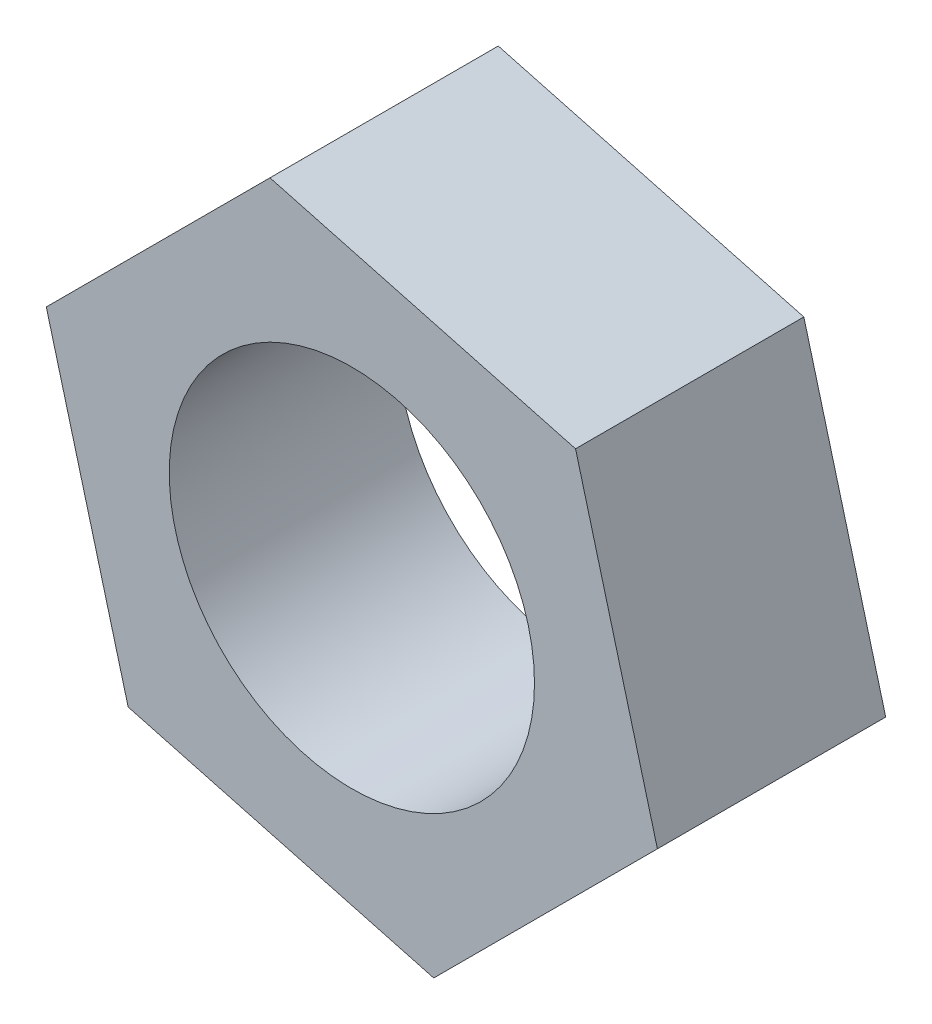
ISO-10303-21;
HEADER;
FILE_DESCRIPTION(('STEP AP214'),'2;1');
FILE_NAME('part.step','',(''),(''),'','','');
FILE_SCHEMA(('AUTOMOTIVE_DESIGN { 1 0 10303 214 1 1 1 1 }'));
ENDSEC;
DATA;
#1=APPLICATION_CONTEXT('core data for automotive mechanical design processes');
#2=APPLICATION_PROTOCOL_DEFINITION('international standard','automotive_design',2000,#1);
#3=PRODUCT_CONTEXT('',#1,'mechanical');
#4=PRODUCT('Part','Part','',(#3));
#5=PRODUCT_RELATED_PRODUCT_CATEGORY('part','',(#4));
#6=PRODUCT_DEFINITION_FORMATION('','',#4);
#7=PRODUCT_DEFINITION_CONTEXT('part definition',#1,'design');
#8=PRODUCT_DEFINITION('design','',#6,#7);
#9=PRODUCT_DEFINITION_SHAPE('','',#8);
#10=(LENGTH_UNIT() NAMED_UNIT(*) SI_UNIT(.MILLI.,.METRE.));
#11=(NAMED_UNIT(*) PLANE_ANGLE_UNIT() SI_UNIT($,.RADIAN.));
#12=(NAMED_UNIT(*) SI_UNIT($,.STERADIAN.) SOLID_ANGLE_UNIT());
#13=UNCERTAINTY_MEASURE_WITH_UNIT(LENGTH_MEASURE(1.E-05),#10,'distance_accuracy_value','');
#14=(GEOMETRIC_REPRESENTATION_CONTEXT(3) GLOBAL_UNCERTAINTY_ASSIGNED_CONTEXT((#13)) GLOBAL_UNIT_ASSIGNED_CONTEXT((#10,
#11,#12)) REPRESENTATION_CONTEXT('',''));
#15=CARTESIAN_POINT('',(0.,0.,0.));
#16=DIRECTION('',(0.,0.,1.));
#17=DIRECTION('',(1.,0.,0.));
#18=AXIS2_PLACEMENT_3D('',#15,#16,#17);
#19=CARTESIAN_POINT('',(0.,0.,5.));
#20=DIRECTION('',(0.,0.,1.));
#21=DIRECTION('',(1.,0.,0.));
#22=AXIS2_PLACEMENT_3D('',#19,#20,#21);
#23=PLANE('',#22);
#24=CARTESIAN_POINT('',(0.,0.,5.));
#25=DIRECTION('',(0.,0.,1.));
#26=DIRECTION('',(1.,0.,0.));
#27=AXIS2_PLACEMENT_3D('',#24,#25,#26);
#28=CIRCLE('',#27,4.);
#29=CARTESIAN_POINT('',(4.,0.,5.));
#30=VERTEX_POINT('',#29);
#31=EDGE_CURVE('E178',#30,#30,#28,.T.);
#32=ORIENTED_EDGE('',*,*,#31,.F.);
#33=EDGE_LOOP('',(#32));
#34=FACE_BOUND('',#33,.T.);
#35=DIRECTION('',(0.70711430388456,0.707099258408503,0.));
#36=VECTOR('',#35,1.);
#37=CARTESIAN_POINT('',(6.69211135256622,-1.79322214017613,5.));
#38=LINE('',#37,#36);
#39=CARTESIAN_POINT('',(1.79307974826223,-6.6921495063643,5.));
#40=VERTEX_POINT('',#39);
#41=CARTESIAN_POINT('',(6.69211135256622,-1.79322214017613,5.));
#42=VERTEX_POINT('',#41);
#43=EDGE_CURVE('E126',#40,#42,#38,.T.);
#44=ORIENTED_EDGE('',*,*,#43,.T.);
#45=DIRECTION('',(-0.25880876883662,0.96592857974763,0.));
#46=VECTOR('',#45,1.);
#47=CARTESIAN_POINT('',(4.89903160430447,4.89892736618804,5.));
#48=LINE('',#47,#46);
#49=CARTESIAN_POINT('',(4.89903160430447,4.89892736618804,5.));
#50=VERTEX_POINT('',#49);
#51=EDGE_CURVE('E87',#42,#50,#48,.T.);
#52=ORIENTED_EDGE('',*,*,#51,.T.);
#53=DIRECTION('',(-0.96592307272118,0.258829321339127,0.));
#54=VECTOR('',#53,1.);
#55=CARTESIAN_POINT('',(-1.79307974826127,6.69214950636405,5.));
#56=LINE('',#55,#54);
#57=CARTESIAN_POINT('',(-1.79307974826127,6.69214950636405,5.));
#58=VERTEX_POINT('',#57);
#59=EDGE_CURVE('E93',#50,#58,#56,.T.);
#60=ORIENTED_EDGE('',*,*,#59,.T.);
#61=DIRECTION('',(-0.70711430388456,-0.707099258408502,0.));
#62=VECTOR('',#61,1.);
#63=CARTESIAN_POINT('',(-6.69211135256526,1.79322214017588,5.));
#64=LINE('',#63,#62);
#65=CARTESIAN_POINT('',(-6.69211135256526,1.79322214017588,5.));
#66=VERTEX_POINT('',#65);
#67=EDGE_CURVE('E139',#58,#66,#64,.T.);
#68=ORIENTED_EDGE('',*,*,#67,.T.);
#69=DIRECTION('',(0.25880876883662,-0.96592857974763,0.));
#70=VECTOR('',#69,1.);
#71=CARTESIAN_POINT('',(-4.89903160430351,-4.8989273661883,5.));
#72=LINE('',#71,#70);
#73=CARTESIAN_POINT('',(-4.89903160430351,-4.8989273661883,5.));
#74=VERTEX_POINT('',#73);
#75=EDGE_CURVE('E142',#66,#74,#72,.T.);
#76=ORIENTED_EDGE('',*,*,#75,.T.);
#77=DIRECTION('',(0.965923072721181,-0.258829321339127,0.));
#78=VECTOR('',#77,1.);
#79=CARTESIAN_POINT('',(1.79307974826223,-6.6921495063643,5.));
#80=LINE('',#79,#78);
#81=EDGE_CURVE('E146',#74,#40,#80,.T.);
#82=ORIENTED_EDGE('',*,*,#81,.T.);
#83=EDGE_LOOP('',(#44,#52,#60,#68,#76,#82));
#84=FACE_BOUND('',#83,.T.);
#85=ADVANCED_FACE('F47',(#34,#84),#23,.T.);
#86=CARTESIAN_POINT('',(0.,0.,0.));
#87=DIRECTION('',(0.,0.,1.));
#88=DIRECTION('',(1.,0.,0.));
#89=AXIS2_PLACEMENT_3D('',#86,#87,#88);
#90=PLANE('',#89);
#91=CARTESIAN_POINT('',(0.,0.,0.));
#92=DIRECTION('',(0.,0.,1.));
#93=DIRECTION('',(1.,0.,0.));
#94=AXIS2_PLACEMENT_3D('',#91,#92,#93);
#95=CIRCLE('',#94,4.);
#96=CARTESIAN_POINT('',(4.,0.,0.));
#97=VERTEX_POINT('',#96);
#98=EDGE_CURVE('E51',#97,#97,#95,.T.);
#99=ORIENTED_EDGE('',*,*,#98,.T.);
#100=EDGE_LOOP('',(#99));
#101=FACE_BOUND('',#100,.T.);
#102=DIRECTION('',(0.25880876883662,-0.96592857974763,0.));
#103=VECTOR('',#102,1.);
#104=CARTESIAN_POINT('',(-4.89903160430351,-4.8989273661883,0.));
#105=LINE('',#104,#103);
#106=CARTESIAN_POINT('',(-6.69211135256526,1.79322214017588,0.));
#107=VERTEX_POINT('',#106);
#108=CARTESIAN_POINT('',(-4.89903160430351,-4.8989273661883,0.));
#109=VERTEX_POINT('',#108);
#110=EDGE_CURVE('E121',#107,#109,#105,.T.);
#111=ORIENTED_EDGE('',*,*,#110,.F.);
#112=DIRECTION('',(-0.70711430388456,-0.707099258408502,0.));
#113=VECTOR('',#112,1.);
#114=CARTESIAN_POINT('',(-6.69211135256526,1.79322214017588,0.));
#115=LINE('',#114,#113);
#116=CARTESIAN_POINT('',(-1.79307974826127,6.69214950636405,0.));
#117=VERTEX_POINT('',#116);
#118=EDGE_CURVE('E172',#117,#107,#115,.T.);
#119=ORIENTED_EDGE('',*,*,#118,.F.);
#120=DIRECTION('',(-0.96592307272118,0.258829321339127,0.));
#121=VECTOR('',#120,1.);
#122=CARTESIAN_POINT('',(-1.79307974826127,6.69214950636405,0.));
#123=LINE('',#122,#121);
#124=CARTESIAN_POINT('',(4.89903160430447,4.89892736618804,0.));
#125=VERTEX_POINT('',#124);
#126=EDGE_CURVE('E98',#125,#117,#123,.T.);
#127=ORIENTED_EDGE('',*,*,#126,.F.);
#128=DIRECTION('',(-0.25880876883662,0.96592857974763,0.));
#129=VECTOR('',#128,1.);
#130=CARTESIAN_POINT('',(4.89903160430447,4.89892736618804,0.));
#131=LINE('',#130,#129);
#132=CARTESIAN_POINT('',(6.69211135256622,-1.79322214017613,0.));
#133=VERTEX_POINT('',#132);
#134=EDGE_CURVE('E66',#133,#125,#131,.T.);
#135=ORIENTED_EDGE('',*,*,#134,.F.);
#136=DIRECTION('',(0.70711430388456,0.707099258408503,0.));
#137=VECTOR('',#136,1.);
#138=CARTESIAN_POINT('',(6.69211135256622,-1.79322214017613,0.));
#139=LINE('',#138,#137);
#140=CARTESIAN_POINT('',(1.79307974826223,-6.6921495063643,0.));
#141=VERTEX_POINT('',#140);
#142=EDGE_CURVE('E120',#141,#133,#139,.T.);
#143=ORIENTED_EDGE('',*,*,#142,.F.);
#144=DIRECTION('',(0.965923072721181,-0.258829321339127,0.));
#145=VECTOR('',#144,1.);
#146=CARTESIAN_POINT('',(1.79307974826223,-6.6921495063643,0.));
#147=LINE('',#146,#145);
#148=EDGE_CURVE('E110',#109,#141,#147,.T.);
#149=ORIENTED_EDGE('',*,*,#148,.F.);
#150=EDGE_LOOP('',(#111,#119,#127,#135,#143,#149));
#151=FACE_BOUND('',#150,.T.);
#152=ADVANCED_FACE('F49',(#101,#151),#90,.F.);
#153=CARTESIAN_POINT('',(-1.79307974826127,6.69214950636405,0.));
#154=DIRECTION('',(0.258829321339127,0.96592307272118,0.));
#155=DIRECTION('',(-0.965923072721181,0.258829321339127,0.));
#156=AXIS2_PLACEMENT_3D('',#153,#154,#155);
#157=PLANE('',#156);
#158=ORIENTED_EDGE('',*,*,#126,.T.);
#159=DIRECTION('',(0.,0.,1.));
#160=VECTOR('',#159,1.);
#161=CARTESIAN_POINT('',(-1.79307974826127,6.69214950636405,0.));
#162=LINE('',#161,#160);
#163=EDGE_CURVE('E133',#117,#58,#162,.T.);
#164=ORIENTED_EDGE('',*,*,#163,.T.);
#165=ORIENTED_EDGE('',*,*,#59,.F.);
#166=DIRECTION('',(0.,0.,1.));
#167=VECTOR('',#166,1.);
#168=CARTESIAN_POINT('',(4.89903160430447,4.89892736618804,0.));
#169=LINE('',#168,#167);
#170=EDGE_CURVE('E11',#125,#50,#169,.T.);
#171=ORIENTED_EDGE('',*,*,#170,.F.);
#172=EDGE_LOOP('',(#158,#164,#165,#171));
#173=FACE_BOUND('',#172,.T.);
#174=ADVANCED_FACE('F162',(#173),#157,.T.);
#175=CARTESIAN_POINT('',(4.89903160430447,4.89892736618804,0.));
#176=DIRECTION('',(0.965928579747629,0.25880876883662,0.));
#177=DIRECTION('',(-0.258808768836621,0.96592857974763,0.));
#178=AXIS2_PLACEMENT_3D('',#175,#176,#177);
#179=PLANE('',#178);
#180=ORIENTED_EDGE('',*,*,#134,.T.);
#181=ORIENTED_EDGE('',*,*,#170,.T.);
#182=ORIENTED_EDGE('',*,*,#51,.F.);
#183=DIRECTION('',(0.,0.,1.));
#184=VECTOR('',#183,1.);
#185=CARTESIAN_POINT('',(6.69211135256622,-1.79322214017613,0.));
#186=LINE('',#185,#184);
#187=EDGE_CURVE('E58',#133,#42,#186,.T.);
#188=ORIENTED_EDGE('',*,*,#187,.F.);
#189=EDGE_LOOP('',(#180,#181,#182,#188));
#190=FACE_BOUND('',#189,.T.);
#191=ADVANCED_FACE('F203',(#190),#179,.T.);
#192=CARTESIAN_POINT('',(6.69211135256622,-1.79322214017613,0.));
#193=DIRECTION('',(0.707099258408502,-0.70711430388456,0.));
#194=DIRECTION('',(0.70711430388456,0.707099258408502,0.));
#195=AXIS2_PLACEMENT_3D('',#192,#193,#194);
#196=PLANE('',#195);
#197=ORIENTED_EDGE('',*,*,#142,.T.);
#198=ORIENTED_EDGE('',*,*,#187,.T.);
#199=ORIENTED_EDGE('',*,*,#43,.F.);
#200=DIRECTION('',(0.,0.,1.));
#201=VECTOR('',#200,1.);
#202=CARTESIAN_POINT('',(1.79307974826223,-6.6921495063643,0.));
#203=LINE('',#202,#201);
#204=EDGE_CURVE('E113',#141,#40,#203,.T.);
#205=ORIENTED_EDGE('',*,*,#204,.F.);
#206=EDGE_LOOP('',(#197,#198,#199,#205));
#207=FACE_BOUND('',#206,.T.);
#208=ADVANCED_FACE('F124',(#207),#196,.T.);
#209=CARTESIAN_POINT('',(1.79307974826223,-6.6921495063643,0.));
#210=DIRECTION('',(-0.258829321339127,-0.965923072721181,0.));
#211=DIRECTION('',(0.965923072721181,-0.258829321339127,0.));
#212=AXIS2_PLACEMENT_3D('',#209,#210,#211);
#213=PLANE('',#212);
#214=ORIENTED_EDGE('',*,*,#148,.T.);
#215=ORIENTED_EDGE('',*,*,#204,.T.);
#216=ORIENTED_EDGE('',*,*,#81,.F.);
#217=DIRECTION('',(0.,0.,1.));
#218=VECTOR('',#217,1.);
#219=CARTESIAN_POINT('',(-4.89903160430351,-4.8989273661883,0.));
#220=LINE('',#219,#218);
#221=EDGE_CURVE('E115',#109,#74,#220,.T.);
#222=ORIENTED_EDGE('',*,*,#221,.F.);
#223=EDGE_LOOP('',(#214,#215,#216,#222));
#224=FACE_BOUND('',#223,.T.);
#225=ADVANCED_FACE('F112',(#224),#213,.T.);
#226=CARTESIAN_POINT('',(-4.89903160430351,-4.8989273661883,0.));
#227=DIRECTION('',(-0.96592857974763,-0.25880876883662,0.));
#228=DIRECTION('',(0.25880876883662,-0.96592857974763,0.));
#229=AXIS2_PLACEMENT_3D('',#226,#227,#228);
#230=PLANE('',#229);
#231=ORIENTED_EDGE('',*,*,#110,.T.);
#232=ORIENTED_EDGE('',*,*,#221,.T.);
#233=ORIENTED_EDGE('',*,*,#75,.F.);
#234=DIRECTION('',(0.,0.,1.));
#235=VECTOR('',#234,1.);
#236=CARTESIAN_POINT('',(-6.69211135256526,1.79322214017588,0.));
#237=LINE('',#236,#235);
#238=EDGE_CURVE('E157',#107,#66,#237,.T.);
#239=ORIENTED_EDGE('',*,*,#238,.F.);
#240=EDGE_LOOP('',(#231,#232,#233,#239));
#241=FACE_BOUND('',#240,.T.);
#242=ADVANCED_FACE('F170',(#241),#230,.T.);
#243=CARTESIAN_POINT('',(-6.69211135256526,1.79322214017588,0.));
#244=DIRECTION('',(-0.707099258408502,0.70711430388456,0.));
#245=DIRECTION('',(-0.70711430388456,-0.707099258408502,0.));
#246=AXIS2_PLACEMENT_3D('',#243,#244,#245);
#247=PLANE('',#246);
#248=ORIENTED_EDGE('',*,*,#118,.T.);
#249=ORIENTED_EDGE('',*,*,#238,.T.);
#250=ORIENTED_EDGE('',*,*,#67,.F.);
#251=ORIENTED_EDGE('',*,*,#163,.F.);
#252=EDGE_LOOP('',(#248,#249,#250,#251));
#253=FACE_BOUND('',#252,.T.);
#254=ADVANCED_FACE('F165',(#253),#247,.T.);
#255=CARTESIAN_POINT('',(0.,0.,-5.));
#256=DIRECTION('',(0.,0.,1.));
#257=DIRECTION('',(1.,0.,0.));
#258=AXIS2_PLACEMENT_3D('',#255,#256,#257);
#259=CYLINDRICAL_SURFACE('',#258,4.);
#260=ORIENTED_EDGE('',*,*,#31,.T.);
#261=EDGE_LOOP('',(#260));
#262=FACE_BOUND('',#261,.T.);
#263=ORIENTED_EDGE('',*,*,#98,.F.);
#264=EDGE_LOOP('',(#263));
#265=FACE_BOUND('',#264,.T.);
#266=ADVANCED_FACE('F188',(#262,#265),#259,.F.);
#267=CLOSED_SHELL('',(#85,#152,#174,#191,#208,#225,#242,#254,#266));
#268=MANIFOLD_SOLID_BREP('B2',#267);
#269=ADVANCED_BREP_SHAPE_REPRESENTATION('',(#18,#268),#14);
#270=SHAPE_DEFINITION_REPRESENTATION(#9,#269);
ENDSEC;
END-ISO-10303-21;
